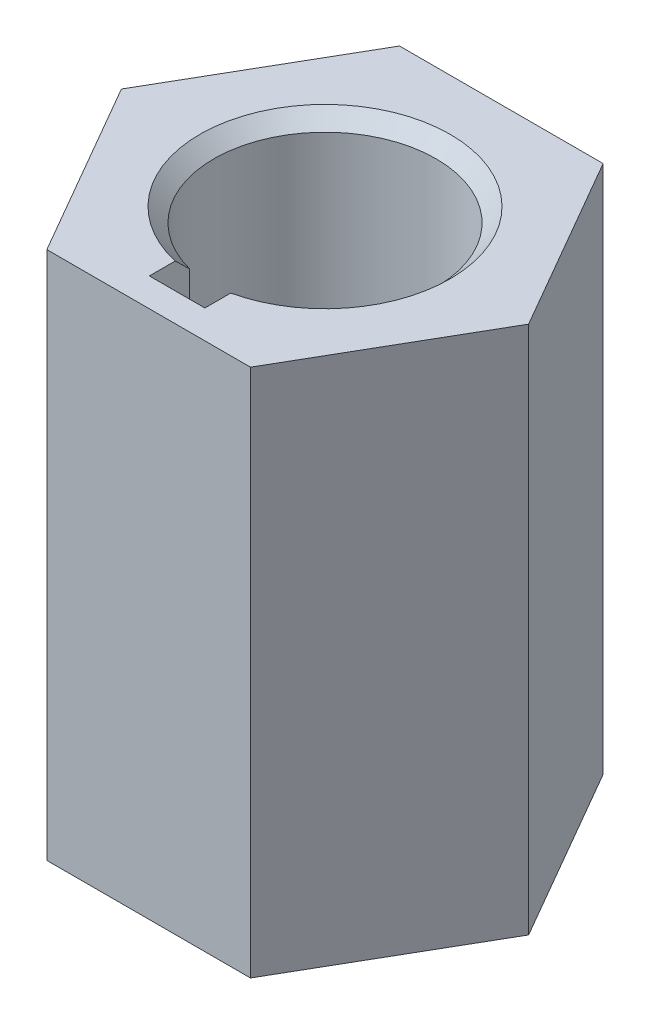
ISO-10303-21;
HEADER;
FILE_DESCRIPTION(('STEP AP214'),'2;1');
FILE_NAME('part.step','',(''),(''),'','','');
FILE_SCHEMA(('AUTOMOTIVE_DESIGN { 1 0 10303 214 1 1 1 1 }'));
ENDSEC;
DATA;
#1=APPLICATION_CONTEXT('core data for automotive mechanical design processes');
#2=APPLICATION_PROTOCOL_DEFINITION('international standard','automotive_design',2000,#1);
#3=PRODUCT_CONTEXT('',#1,'mechanical');
#4=PRODUCT('Part','Part','',(#3));
#5=PRODUCT_RELATED_PRODUCT_CATEGORY('part','',(#4));
#6=PRODUCT_DEFINITION_FORMATION('','',#4);
#7=PRODUCT_DEFINITION_CONTEXT('part definition',#1,'design');
#8=PRODUCT_DEFINITION('design','',#6,#7);
#9=PRODUCT_DEFINITION_SHAPE('','',#8);
#10=(LENGTH_UNIT() NAMED_UNIT(*) SI_UNIT(.MILLI.,.METRE.));
#11=(NAMED_UNIT(*) PLANE_ANGLE_UNIT() SI_UNIT($,.RADIAN.));
#12=(NAMED_UNIT(*) SI_UNIT($,.STERADIAN.) SOLID_ANGLE_UNIT());
#13=UNCERTAINTY_MEASURE_WITH_UNIT(LENGTH_MEASURE(1.E-05),#10,'distance_accuracy_value','');
#14=(GEOMETRIC_REPRESENTATION_CONTEXT(3) GLOBAL_UNCERTAINTY_ASSIGNED_CONTEXT((#13)) GLOBAL_UNIT_ASSIGNED_CONTEXT((#10,
#11,#12)) REPRESENTATION_CONTEXT('',''));
#15=CARTESIAN_POINT('',(0.,0.,0.));
#16=DIRECTION('',(0.,0.,1.));
#17=DIRECTION('',(1.,0.,0.));
#18=AXIS2_PLACEMENT_3D('',#15,#16,#17);
#19=CARTESIAN_POINT('',(3.66617420935419,19.05,6.34999999999996));
#20=DIRECTION('',(-0.866025403784444,0.,-0.499999999999991));
#21=DIRECTION('',(-0.499999999999991,0.,0.866025403784444));
#22=AXIS2_PLACEMENT_3D('',#19,#20,#21);
#23=PLANE('',#22);
#24=DIRECTION('',(0.,1.,0.));
#25=VECTOR('',#24,1.);
#26=CARTESIAN_POINT('',(7.33234841870825,19.05,0.));
#27=LINE('',#26,#25);
#28=CARTESIAN_POINT('',(7.33234841870825,0.,0.));
#29=VERTEX_POINT('',#28);
#30=CARTESIAN_POINT('',(7.33234841870825,19.05,0.));
#31=VERTEX_POINT('',#30);
#32=EDGE_CURVE('E262',#29,#31,#27,.T.);
#33=ORIENTED_EDGE('',*,*,#32,.T.);
#34=DIRECTION('',(0.499999999999991,0.,-0.866025403784444));
#35=VECTOR('',#34,1.);
#36=CARTESIAN_POINT('',(3.66617420935419,19.05,6.34999999999996));
#37=LINE('',#36,#35);
#38=CARTESIAN_POINT('',(3.66617420935418,19.05,6.34999999999998));
#39=VERTEX_POINT('',#38);
#40=EDGE_CURVE('E185',#39,#31,#37,.T.);
#41=ORIENTED_EDGE('',*,*,#40,.F.);
#42=DIRECTION('',(0.,1.,0.));
#43=VECTOR('',#42,1.);
#44=CARTESIAN_POINT('',(3.66617420935419,19.05,6.34999999999996));
#45=LINE('',#44,#43);
#46=CARTESIAN_POINT('',(3.66617420935418,0.,6.34999999999998));
#47=VERTEX_POINT('',#46);
#48=EDGE_CURVE('E161',#39,#47,#45,.F.);
#49=ORIENTED_EDGE('',*,*,#48,.T.);
#50=DIRECTION('',(0.499999999999991,0.,-0.866025403784444));
#51=VECTOR('',#50,1.);
#52=CARTESIAN_POINT('',(3.66617420935419,0.,6.34999999999996));
#53=LINE('',#52,#51);
#54=EDGE_CURVE('E212',#47,#29,#53,.T.);
#55=ORIENTED_EDGE('',*,*,#54,.T.);
#56=EDGE_LOOP('',(#33,#41,#49,#55));
#57=FACE_BOUND('',#56,.T.);
#58=ADVANCED_FACE('F16',(#57),#23,.F.);
#59=CARTESIAN_POINT('',(7.33234841870825,19.05,0.));
#60=DIRECTION('',(-0.866025403784433,0.,0.500000000000009));
#61=DIRECTION('',(0.500000000000009,0.,0.866025403784433));
#62=AXIS2_PLACEMENT_3D('',#59,#60,#61);
#63=PLANE('',#62);
#64=DIRECTION('',(0.,1.,0.));
#65=VECTOR('',#64,1.);
#66=CARTESIAN_POINT('',(3.66617420935405,19.05,-6.35000000000004));
#67=LINE('',#66,#65);
#68=CARTESIAN_POINT('',(3.66617420935405,0.,-6.35000000000004));
#69=VERTEX_POINT('',#68);
#70=CARTESIAN_POINT('',(3.66617420935405,19.05,-6.35000000000004));
#71=VERTEX_POINT('',#70);
#72=EDGE_CURVE('E258',#69,#71,#67,.T.);
#73=ORIENTED_EDGE('',*,*,#72,.T.);
#74=DIRECTION('',(-0.500000000000009,0.,-0.866025403784433));
#75=VECTOR('',#74,1.);
#76=CARTESIAN_POINT('',(7.33234841870825,19.05,0.));
#77=LINE('',#76,#75);
#78=EDGE_CURVE('E182',#31,#71,#77,.T.);
#79=ORIENTED_EDGE('',*,*,#78,.F.);
#80=ORIENTED_EDGE('',*,*,#32,.F.);
#81=DIRECTION('',(-0.500000000000009,0.,-0.866025403784433));
#82=VECTOR('',#81,1.);
#83=CARTESIAN_POINT('',(7.33234841870825,0.,0.));
#84=LINE('',#83,#82);
#85=EDGE_CURVE('E231',#29,#69,#84,.T.);
#86=ORIENTED_EDGE('',*,*,#85,.T.);
#87=EDGE_LOOP('',(#73,#79,#80,#86));
#88=FACE_BOUND('',#87,.T.);
#89=ADVANCED_FACE('F310',(#88),#63,.F.);
#90=CARTESIAN_POINT('',(3.66617420935405,19.05,-6.35000000000004));
#91=DIRECTION('',(0.,0.,1.));
#92=DIRECTION('',(1.,0.,0.));
#93=AXIS2_PLACEMENT_3D('',#90,#91,#92);
#94=PLANE('',#93);
#95=DIRECTION('',(0.,1.,0.));
#96=VECTOR('',#95,1.);
#97=CARTESIAN_POINT('',(-3.66617420935419,19.05,-6.34999999999996));
#98=LINE('',#97,#96);
#99=CARTESIAN_POINT('',(-3.66617420935418,0.,-6.34999999999998));
#100=VERTEX_POINT('',#99);
#101=CARTESIAN_POINT('',(-3.66617420935418,19.05,-6.34999999999998));
#102=VERTEX_POINT('',#101);
#103=EDGE_CURVE('E254',#100,#102,#98,.T.);
#104=ORIENTED_EDGE('',*,*,#103,.T.);
#105=DIRECTION('',(1.,0.,0.));
#106=VECTOR('',#105,1.);
#107=CARTESIAN_POINT('',(0.,19.05,-6.35000000000004));
#108=LINE('',#107,#106);
#109=EDGE_CURVE('E179',#71,#102,#108,.F.);
#110=ORIENTED_EDGE('',*,*,#109,.F.);
#111=ORIENTED_EDGE('',*,*,#72,.F.);
#112=DIRECTION('',(1.,0.,0.));
#113=VECTOR('',#112,1.);
#114=CARTESIAN_POINT('',(0.,0.,-6.35000000000004));
#115=LINE('',#114,#113);
#116=EDGE_CURVE('E227',#69,#100,#115,.F.);
#117=ORIENTED_EDGE('',*,*,#116,.T.);
#118=EDGE_LOOP('',(#104,#110,#111,#117));
#119=FACE_BOUND('',#118,.T.);
#120=ADVANCED_FACE('F307',(#119),#94,.F.);
#121=CARTESIAN_POINT('',(-3.66617420935419,19.05,-6.34999999999996));
#122=DIRECTION('',(0.866025403784444,0.,0.499999999999991));
#123=DIRECTION('',(0.499999999999991,0.,-0.866025403784444));
#124=AXIS2_PLACEMENT_3D('',#121,#122,#123);
#125=PLANE('',#124);
#126=DIRECTION('',(0.,1.,0.));
#127=VECTOR('',#126,1.);
#128=CARTESIAN_POINT('',(-7.33234841870825,19.05,0.));
#129=LINE('',#128,#127);
#130=CARTESIAN_POINT('',(-7.33234841870825,0.,0.));
#131=VERTEX_POINT('',#130);
#132=CARTESIAN_POINT('',(-7.33234841870825,19.05,0.));
#133=VERTEX_POINT('',#132);
#134=EDGE_CURVE('E162',#131,#133,#129,.T.);
#135=ORIENTED_EDGE('',*,*,#134,.T.);
#136=DIRECTION('',(-0.499999999999991,0.,0.866025403784444));
#137=VECTOR('',#136,1.);
#138=CARTESIAN_POINT('',(-3.66617420935419,19.05,-6.34999999999996));
#139=LINE('',#138,#137);
#140=EDGE_CURVE('E147',#102,#133,#139,.T.);
#141=ORIENTED_EDGE('',*,*,#140,.F.);
#142=ORIENTED_EDGE('',*,*,#103,.F.);
#143=DIRECTION('',(-0.499999999999991,0.,0.866025403784444));
#144=VECTOR('',#143,1.);
#145=CARTESIAN_POINT('',(-3.66617420935419,0.,-6.34999999999996));
#146=LINE('',#145,#144);
#147=EDGE_CURVE('E223',#100,#131,#146,.T.);
#148=ORIENTED_EDGE('',*,*,#147,.T.);
#149=EDGE_LOOP('',(#135,#141,#142,#148));
#150=FACE_BOUND('',#149,.T.);
#151=ADVANCED_FACE('F304',(#150),#125,.F.);
#152=CARTESIAN_POINT('',(-7.33234841870825,19.05,0.));
#153=DIRECTION('',(0.866025403784434,0.,-0.500000000000008));
#154=DIRECTION('',(-0.500000000000008,0.,-0.866025403784434));
#155=AXIS2_PLACEMENT_3D('',#152,#153,#154);
#156=PLANE('',#155);
#157=DIRECTION('',(0.,1.,0.));
#158=VECTOR('',#157,1.);
#159=CARTESIAN_POINT('',(-3.66617420935407,19.05,6.35000000000004));
#160=LINE('',#159,#158);
#161=CARTESIAN_POINT('',(-3.66617420935407,0.,6.35000000000004));
#162=VERTEX_POINT('',#161);
#163=CARTESIAN_POINT('',(-3.66617420935407,19.05,6.35000000000004));
#164=VERTEX_POINT('',#163);
#165=EDGE_CURVE('E153',#162,#164,#160,.T.);
#166=ORIENTED_EDGE('',*,*,#165,.T.);
#167=DIRECTION('',(0.500000000000008,0.,0.866025403784434));
#168=VECTOR('',#167,1.);
#169=CARTESIAN_POINT('',(-7.33234841870825,19.05,0.));
#170=LINE('',#169,#168);
#171=EDGE_CURVE('E140',#133,#164,#170,.T.);
#172=ORIENTED_EDGE('',*,*,#171,.F.);
#173=ORIENTED_EDGE('',*,*,#134,.F.);
#174=DIRECTION('',(0.500000000000008,0.,0.866025403784434));
#175=VECTOR('',#174,1.);
#176=CARTESIAN_POINT('',(-7.33234841870825,0.,0.));
#177=LINE('',#176,#175);
#178=EDGE_CURVE('E156',#131,#162,#177,.T.);
#179=ORIENTED_EDGE('',*,*,#178,.T.);
#180=EDGE_LOOP('',(#166,#172,#173,#179));
#181=FACE_BOUND('',#180,.T.);
#182=ADVANCED_FACE('F154',(#181),#156,.F.);
#183=CARTESIAN_POINT('',(-3.66617420935407,19.05,6.35000000000004));
#184=DIRECTION('',(0.,0.,-1.));
#185=DIRECTION('',(-1.,0.,0.));
#186=AXIS2_PLACEMENT_3D('',#183,#184,#185);
#187=PLANE('',#186);
#188=ORIENTED_EDGE('',*,*,#48,.F.);
#189=DIRECTION('',(1.,0.,0.));
#190=VECTOR('',#189,1.);
#191=CARTESIAN_POINT('',(0.,19.05,6.35000000000004));
#192=LINE('',#191,#190);
#193=EDGE_CURVE('E144',#164,#39,#192,.T.);
#194=ORIENTED_EDGE('',*,*,#193,.F.);
#195=ORIENTED_EDGE('',*,*,#165,.F.);
#196=DIRECTION('',(1.,0.,0.));
#197=VECTOR('',#196,1.);
#198=CARTESIAN_POINT('',(0.,0.,6.35000000000004));
#199=LINE('',#198,#197);
#200=EDGE_CURVE('E218',#162,#47,#199,.T.);
#201=ORIENTED_EDGE('',*,*,#200,.T.);
#202=EDGE_LOOP('',(#188,#194,#195,#201));
#203=FACE_BOUND('',#202,.T.);
#204=ADVANCED_FACE('F164',(#203),#187,.F.);
#205=CARTESIAN_POINT('',(0.,0.,0.));
#206=DIRECTION('',(0.,1.,0.));
#207=DIRECTION('',(0.,0.,1.));
#208=AXIS2_PLACEMENT_3D('',#205,#206,#207);
#209=PLANE('',#208);
#210=DIRECTION('',(0.,0.,1.));
#211=VECTOR('',#210,1.);
#212=CARTESIAN_POINT('',(1.,0.,3.87298334620742));
#213=LINE('',#212,#211);
#214=CARTESIAN_POINT('',(1.,2.8421709430404E-11,4.39568697704235));
#215=VERTEX_POINT('',#214);
#216=CARTESIAN_POINT('',(1.,0.,5.32547116152768));
#217=VERTEX_POINT('',#216);
#218=EDGE_CURVE('E171',#215,#217,#213,.T.);
#219=ORIENTED_EDGE('',*,*,#218,.F.);
#220=CARTESIAN_POINT('',(0.,5.6843418860808E-11,0.));
#221=DIRECTION('',(0.,-1.,0.));
#222=DIRECTION('',(0.,0.,-1.));
#223=AXIS2_PLACEMENT_3D('',#220,#221,#222);
#224=CIRCLE('',#223,4.50799999998708);
#225=CARTESIAN_POINT('',(-1.,2.8421709430404E-11,4.39568697704235));
#226=VERTEX_POINT('',#225);
#227=EDGE_CURVE('E332',#215,#226,#224,.F.);
#228=ORIENTED_EDGE('',*,*,#227,.T.);
#229=DIRECTION('',(0.,0.,1.));
#230=VECTOR('',#229,1.);
#231=CARTESIAN_POINT('',(-1.,0.,0.));
#232=LINE('',#231,#230);
#233=CARTESIAN_POINT('',(-1.,0.,5.32547116152768));
#234=VERTEX_POINT('',#233);
#235=EDGE_CURVE('E209',#234,#226,#232,.F.);
#236=ORIENTED_EDGE('',*,*,#235,.F.);
#237=DIRECTION('',(-1.,0.,0.));
#238=VECTOR('',#237,1.);
#239=CARTESIAN_POINT('',(-1.,0.,5.32547116152768));
#240=LINE('',#239,#238);
#241=EDGE_CURVE('E188',#217,#234,#240,.T.);
#242=ORIENTED_EDGE('',*,*,#241,.F.);
#243=EDGE_LOOP('',(#219,#228,#236,#242));
#244=FACE_BOUND('',#243,.T.);
#245=ORIENTED_EDGE('',*,*,#200,.F.);
#246=ORIENTED_EDGE('',*,*,#178,.F.);
#247=ORIENTED_EDGE('',*,*,#147,.F.);
#248=ORIENTED_EDGE('',*,*,#116,.F.);
#249=ORIENTED_EDGE('',*,*,#85,.F.);
#250=ORIENTED_EDGE('',*,*,#54,.F.);
#251=EDGE_LOOP('',(#245,#246,#247,#248,#249,#250));
#252=FACE_BOUND('',#251,.T.);
#253=ADVANCED_FACE('F295',(#244,#252),#209,.F.);
#254=CARTESIAN_POINT('',(-1.,19.05,5.32547116152768));
#255=DIRECTION('',(0.,0.,-1.));
#256=DIRECTION('',(-1.,0.,0.));
#257=AXIS2_PLACEMENT_3D('',#254,#255,#256);
#258=PLANE('',#257);
#259=DIRECTION('',(1.,0.,0.));
#260=VECTOR('',#259,1.);
#261=CARTESIAN_POINT('',(0.,19.05,5.32547116152768));
#262=LINE('',#261,#260);
#263=CARTESIAN_POINT('',(1.,19.05,5.32547116152768));
#264=VERTEX_POINT('',#263);
#265=CARTESIAN_POINT('',(-1.,19.05,5.32547116152768));
#266=VERTEX_POINT('',#265);
#267=EDGE_CURVE('E166',#264,#266,#262,.F.);
#268=ORIENTED_EDGE('',*,*,#267,.F.);
#269=DIRECTION('',(0.,1.,0.));
#270=VECTOR('',#269,1.);
#271=CARTESIAN_POINT('',(1.,19.05,5.32547116152768));
#272=LINE('',#271,#270);
#273=EDGE_CURVE('E237',#217,#264,#272,.T.);
#274=ORIENTED_EDGE('',*,*,#273,.F.);
#275=ORIENTED_EDGE('',*,*,#241,.T.);
#276=DIRECTION('',(0.,1.,0.));
#277=VECTOR('',#276,1.);
#278=CARTESIAN_POINT('',(-1.,19.05,5.32547116152768));
#279=LINE('',#278,#277);
#280=EDGE_CURVE('E193',#266,#234,#279,.F.);
#281=ORIENTED_EDGE('',*,*,#280,.F.);
#282=EDGE_LOOP('',(#268,#274,#275,#281));
#283=FACE_BOUND('',#282,.T.);
#284=ADVANCED_FACE('F291',(#283),#258,.T.);
#285=CARTESIAN_POINT('',(0.,19.05,0.));
#286=DIRECTION('',(0.,1.,0.));
#287=DIRECTION('',(0.,0.,1.));
#288=AXIS2_PLACEMENT_3D('',#285,#286,#287);
#289=PLANE('',#288);
#290=DIRECTION('',(0.,0.,1.));
#291=VECTOR('',#290,1.);
#292=CARTESIAN_POINT('',(1.,19.05,3.87298334620742));
#293=LINE('',#292,#291);
#294=CARTESIAN_POINT('',(1.,19.0500000000249,4.3956869769877));
#295=VERTEX_POINT('',#294);
#296=EDGE_CURVE('E242',#264,#295,#293,.F.);
#297=ORIENTED_EDGE('',*,*,#296,.F.);
#298=ORIENTED_EDGE('',*,*,#267,.T.);
#299=DIRECTION('',(0.,0.,-1.));
#300=VECTOR('',#299,1.);
#301=CARTESIAN_POINT('',(-1.,19.05,5.32547116152768));
#302=LINE('',#301,#300);
#303=CARTESIAN_POINT('',(-1.,19.0500000000249,4.3956869769877));
#304=VERTEX_POINT('',#303);
#305=EDGE_CURVE('E189',#304,#266,#302,.F.);
#306=ORIENTED_EDGE('',*,*,#305,.F.);
#307=CARTESIAN_POINT('',(0.,19.0500000000497,0.));
#308=DIRECTION('',(0.,1.,0.));
#309=DIRECTION('',(0.,0.,1.));
#310=AXIS2_PLACEMENT_3D('',#307,#308,#309);
#311=CIRCLE('',#310,4.50799999998708);
#312=EDGE_CURVE('E275',#304,#295,#311,.F.);
#313=ORIENTED_EDGE('',*,*,#312,.T.);
#314=EDGE_LOOP('',(#297,#298,#306,#313));
#315=FACE_BOUND('',#314,.T.);
#316=ORIENTED_EDGE('',*,*,#171,.T.);
#317=ORIENTED_EDGE('',*,*,#193,.T.);
#318=ORIENTED_EDGE('',*,*,#40,.T.);
#319=ORIENTED_EDGE('',*,*,#78,.T.);
#320=ORIENTED_EDGE('',*,*,#109,.T.);
#321=ORIENTED_EDGE('',*,*,#140,.T.);
#322=EDGE_LOOP('',(#316,#317,#318,#319,#320,#321));
#323=FACE_BOUND('',#322,.T.);
#324=ADVANCED_FACE('F142',(#315,#323),#289,.T.);
#325=CARTESIAN_POINT('',(1.,19.05,3.87298334620742));
#326=DIRECTION('',(-1.,0.,0.));
#327=DIRECTION('',(0.,0.,1.));
#328=AXIS2_PLACEMENT_3D('',#325,#326,#327);
#329=PLANE('',#328);
#330=ORIENTED_EDGE('',*,*,#296,.T.);
#331=CARTESIAN_POINT('',(1.0000000000079,19.0500000000374,4.39568697701024));
#332=CARTESIAN_POINT('',(1.00000000000395,18.9651806631577,4.30871808857146));
#333=CARTESIAN_POINT('',(1.00000000000132,18.8804376633176,4.22167501045064));
#334=CARTESIAN_POINT('',(0.999999999998683,18.7111043299529,4.04744046685619));
#335=CARTESIAN_POINT('',(0.999999999998683,18.6265139964422,3.96024900136897));
#336=CARTESIAN_POINT('',(1.,18.5419999999852,3.8729833461861));
#337=B_SPLINE_CURVE_WITH_KNOTS('',3,(#331,#332,#333,#334,#335,#336),.UNSPECIFIED.,.F.,.F.,(4,2,
4),(0.,0.364445964768106,0.728891962956237),.UNSPECIFIED.);
#338=CARTESIAN_POINT('',(1.,18.5419999999955,3.87298334619676));
#339=VERTEX_POINT('',#338);
#340=EDGE_CURVE('E266',#295,#339,#337,.T.);
#341=ORIENTED_EDGE('',*,*,#340,.T.);
#342=DIRECTION('',(0.,-1.,0.));
#343=VECTOR('',#342,1.);
#344=CARTESIAN_POINT('',(0.999999999999999,19.05,3.87298334620742));
#345=LINE('',#344,#343);
#346=CARTESIAN_POINT('',(1.,0.508000000012401,3.87298334621729));
#347=VERTEX_POINT('',#346);
#348=EDGE_CURVE('E174',#339,#347,#345,.T.);
#349=ORIENTED_EDGE('',*,*,#348,.T.);
#350=CARTESIAN_POINT('',(0.999999999993275,0.508000000020763,3.87298334622325));
#351=CARTESIAN_POINT('',(0.999999999996637,0.423486003579103,3.96024900140564));
#352=CARTESIAN_POINT('',(0.999999999998879,0.338895670082283,4.04744046689097));
#353=CARTESIAN_POINT('',(1.00000000000112,0.169562336742334,4.22167501047878));
#354=CARTESIAN_POINT('',(1.00000000000112,0.0848193369132057,4.30871808859486));
#355=CARTESIAN_POINT('',(1.,4.29179721371921E-11,4.39568697702749));
#356=B_SPLINE_CURVE_WITH_KNOTS('',3,(#350,#351,#352,#353,#354,#355),.UNSPECIFIED.,.F.,.F.,(4,2,
4),(0.,0.364445998155071,0.728891962890115),.UNSPECIFIED.);
#357=EDGE_CURVE('E19',#347,#215,#356,.T.);
#358=ORIENTED_EDGE('',*,*,#357,.T.);
#359=ORIENTED_EDGE('',*,*,#218,.T.);
#360=ORIENTED_EDGE('',*,*,#273,.T.);
#361=EDGE_LOOP('',(#330,#341,#349,#358,#359,#360));
#362=FACE_BOUND('',#361,.T.);
#363=ADVANCED_FACE('F281',(#362),#329,.T.);
#364=CARTESIAN_POINT('',(0.,5.6843418860808E-11,0.));
#365=DIRECTION('',(0.,-1.,0.));
#366=DIRECTION('',(0.,0.,-1.));
#367=AXIS2_PLACEMENT_3D('',#364,#365,#366);
#368=CONICAL_SURFACE('',#367,4.50799999998708,0.785398163397448);
#369=CARTESIAN_POINT('',(0.,0.507999999999998,0.));
#370=DIRECTION('',(0.,-1.,0.));
#371=DIRECTION('',(0.,0.,-1.));
#372=AXIS2_PLACEMENT_3D('',#369,#370,#371);
#373=CIRCLE('',#372,4.);
#374=CARTESIAN_POINT('',(-0.999999999999999,0.508000000012435,3.87298334621725));
#375=VERTEX_POINT('',#374);
#376=EDGE_CURVE('E71',#347,#375,#373,.F.);
#377=ORIENTED_EDGE('',*,*,#376,.T.);
#378=CARTESIAN_POINT('',(-0.999999999990879,3.05350232949664E-11,4.39568697702903));
#379=CARTESIAN_POINT('',(-0.999999999995439,0.084819336904087,4.3087180885973));
#380=CARTESIAN_POINT('',(-0.99999999999848,0.169562336736221,4.22167501048186));
#381=CARTESIAN_POINT('',(-1.00000000000152,0.338895670081661,4.04744046689482));
#382=CARTESIAN_POINT('',(-1.00000000000152,0.423486003580965,3.96024900140963));
#383=CARTESIAN_POINT('',(-1.,0.508000000024852,3.87298334622711));
#384=B_SPLINE_CURVE_WITH_KNOTS('',3,(#378,#379,#380,#381,#382,#383),.UNSPECIFIED.,.F.,.F.,(4,2,
4),(0.,0.364445964739961,0.728891962899936),.UNSPECIFIED.);
#385=EDGE_CURVE('E194',#226,#375,#384,.T.);
#386=ORIENTED_EDGE('',*,*,#385,.F.);
#387=ORIENTED_EDGE('',*,*,#227,.F.);
#388=ORIENTED_EDGE('',*,*,#357,.F.);
#389=EDGE_LOOP('',(#377,#386,#387,#388));
#390=FACE_BOUND('',#389,.T.);
#391=ADVANCED_FACE('F285',(#390),#368,.F.);
#392=CARTESIAN_POINT('',(-1.,19.05,5.32547116152768));
#393=DIRECTION('',(1.,0.,0.));
#394=DIRECTION('',(0.,0.,-1.));
#395=AXIS2_PLACEMENT_3D('',#392,#393,#394);
#396=PLANE('',#395);
#397=ORIENTED_EDGE('',*,*,#305,.T.);
#398=ORIENTED_EDGE('',*,*,#280,.T.);
#399=ORIENTED_EDGE('',*,*,#235,.T.);
#400=ORIENTED_EDGE('',*,*,#385,.T.);
#401=DIRECTION('',(0.,-1.,0.));
#402=VECTOR('',#401,1.);
#403=CARTESIAN_POINT('',(-0.999999999999999,19.05,3.87298334620742));
#404=LINE('',#403,#402);
#405=CARTESIAN_POINT('',(-0.999999999999999,18.5419999999926,3.87298334619676));
#406=VERTEX_POINT('',#405);
#407=EDGE_CURVE('E32',#375,#406,#404,.F.);
#408=ORIENTED_EDGE('',*,*,#407,.T.);
#409=CARTESIAN_POINT('',(-1.,18.5419999999852,3.8729833461861));
#410=CARTESIAN_POINT('',(-1.,18.6265139964415,3.96024900136986));
#411=CARTESIAN_POINT('',(-1.,18.7111043299523,4.0474404668572));
#412=CARTESIAN_POINT('',(-1.,18.8804376633189,4.22167501045029));
#413=CARTESIAN_POINT('',(-1.,18.9651806631606,4.30871808856965));
#414=CARTESIAN_POINT('',(-1.,19.0500000000429,4.3956869770062));
#415=B_SPLINE_CURVE_WITH_KNOTS('',3,(#409,#410,#411,#412,#413,#414),.UNSPECIFIED.,.F.,.F.,(4,2,
4),(0.,0.364445998188589,0.728891962957158),.UNSPECIFIED.);
#416=EDGE_CURVE('E44',#406,#304,#415,.T.);
#417=ORIENTED_EDGE('',*,*,#416,.T.);
#418=EDGE_LOOP('',(#397,#398,#399,#400,#408,#417));
#419=FACE_BOUND('',#418,.T.);
#420=ADVANCED_FACE('F324',(#419),#396,.T.);
#421=CARTESIAN_POINT('',(0.,19.0500000000497,0.));
#422=DIRECTION('',(0.,1.,0.));
#423=DIRECTION('',(0.,0.,1.));
#424=AXIS2_PLACEMENT_3D('',#421,#422,#423);
#425=CONICAL_SURFACE('',#424,4.50799999998708,0.7853981633415);
#426=ORIENTED_EDGE('',*,*,#312,.F.);
#427=ORIENTED_EDGE('',*,*,#416,.F.);
#428=CARTESIAN_POINT('',(0.,18.542,0.));
#429=DIRECTION('',(0.,-1.,0.));
#430=DIRECTION('',(0.,0.,-1.));
#431=AXIS2_PLACEMENT_3D('',#428,#429,#430);
#432=CIRCLE('',#431,4.);
#433=EDGE_CURVE('E11',#406,#339,#432,.T.);
#434=ORIENTED_EDGE('',*,*,#433,.T.);
#435=ORIENTED_EDGE('',*,*,#340,.F.);
#436=EDGE_LOOP('',(#426,#427,#434,#435));
#437=FACE_BOUND('',#436,.T.);
#438=ADVANCED_FACE('F277',(#437),#425,.F.);
#439=CARTESIAN_POINT('',(0.,19.05,0.));
#440=DIRECTION('',(0.,-1.,0.));
#441=DIRECTION('',(0.,0.,-1.));
#442=AXIS2_PLACEMENT_3D('',#439,#440,#441);
#443=CYLINDRICAL_SURFACE('',#442,4.);
#444=ORIENTED_EDGE('',*,*,#433,.F.);
#445=ORIENTED_EDGE('',*,*,#407,.F.);
#446=ORIENTED_EDGE('',*,*,#376,.F.);
#447=ORIENTED_EDGE('',*,*,#348,.F.);
#448=EDGE_LOOP('',(#444,#445,#446,#447));
#449=FACE_BOUND('',#448,.T.);
#450=ADVANCED_FACE('F319',(#449),#443,.F.);
#451=CLOSED_SHELL('',(#58,#89,#120,#151,#182,#204,#253,#284,#324,#363,#391,#420,#438,#450));
#452=MANIFOLD_SOLID_BREP('B1',#451);
#453=ADVANCED_BREP_SHAPE_REPRESENTATION('',(#18,#452),#14);
#454=SHAPE_DEFINITION_REPRESENTATION(#9,#453);
ENDSEC;
END-ISO-10303-21;
